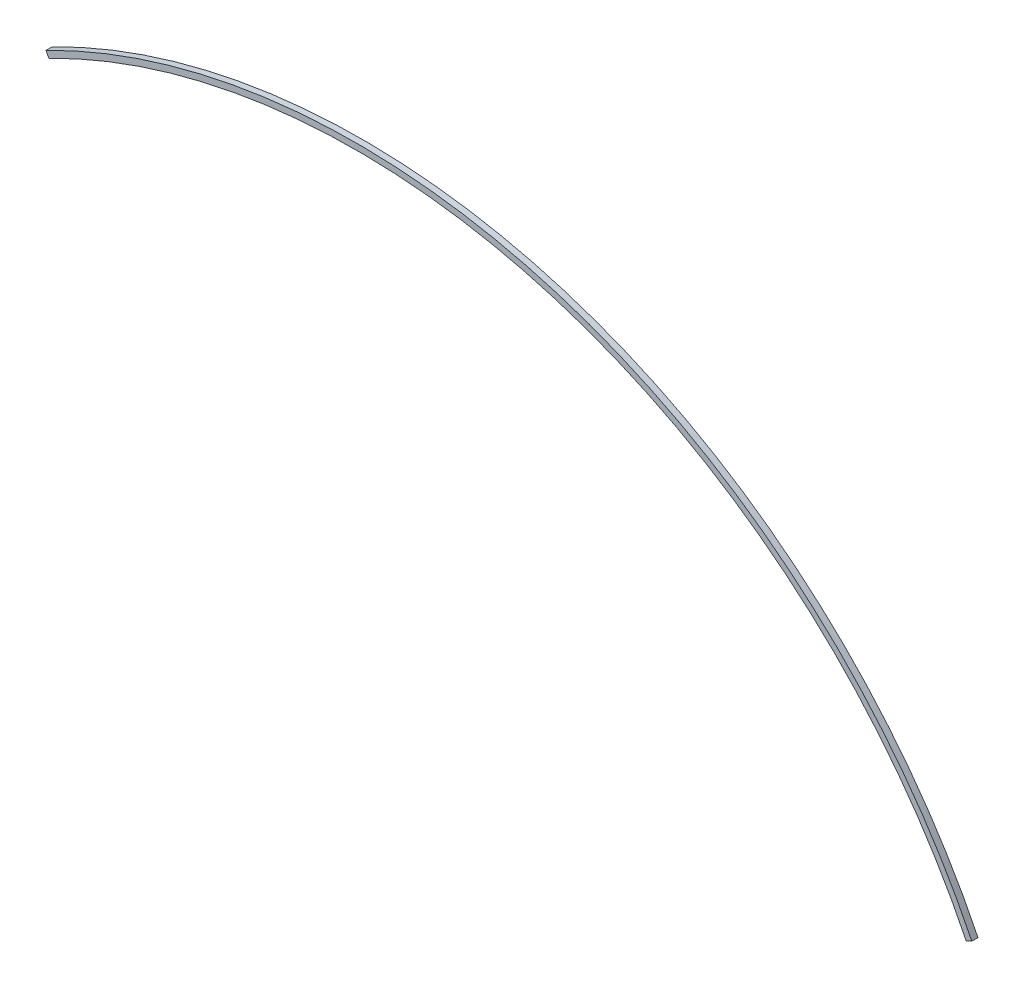
ISO-10303-21;
HEADER;
FILE_DESCRIPTION(('STEP AP214'),'2;1');
FILE_NAME('part.step','',(''),(''),'','','');
FILE_SCHEMA(('AUTOMOTIVE_DESIGN { 1 0 10303 214 1 1 1 1 }'));
ENDSEC;
DATA;
#1=APPLICATION_CONTEXT('core data for automotive mechanical design processes');
#2=APPLICATION_PROTOCOL_DEFINITION('international standard','automotive_design',2000,#1);
#3=PRODUCT_CONTEXT('',#1,'mechanical');
#4=PRODUCT('Part','Part','',(#3));
#5=PRODUCT_RELATED_PRODUCT_CATEGORY('part','',(#4));
#6=PRODUCT_DEFINITION_FORMATION('','',#4);
#7=PRODUCT_DEFINITION_CONTEXT('part definition',#1,'design');
#8=PRODUCT_DEFINITION('design','',#6,#7);
#9=PRODUCT_DEFINITION_SHAPE('','',#8);
#10=(LENGTH_UNIT() NAMED_UNIT(*) SI_UNIT(.MILLI.,.METRE.));
#11=(NAMED_UNIT(*) PLANE_ANGLE_UNIT() SI_UNIT($,.RADIAN.));
#12=(NAMED_UNIT(*) SI_UNIT($,.STERADIAN.) SOLID_ANGLE_UNIT());
#13=UNCERTAINTY_MEASURE_WITH_UNIT(LENGTH_MEASURE(1.E-05),#10,'distance_accuracy_value','');
#14=(GEOMETRIC_REPRESENTATION_CONTEXT(3) GLOBAL_UNCERTAINTY_ASSIGNED_CONTEXT((#13)) GLOBAL_UNIT_ASSIGNED_CONTEXT((#10,
#11,#12)) REPRESENTATION_CONTEXT('',''));
#15=CARTESIAN_POINT('',(0.,0.,0.));
#16=DIRECTION('',(0.,0.,1.));
#17=DIRECTION('',(1.,0.,0.));
#18=AXIS2_PLACEMENT_3D('',#15,#16,#17);
#19=CARTESIAN_POINT('',(4.36837771340562,13.1051331402177,5.));
#20=DIRECTION('',(0.,0.,-1.));
#21=DIRECTION('',(-1.,0.,0.));
#22=AXIS2_PLACEMENT_3D('',#19,#20,#21);
#23=CYLINDRICAL_SURFACE('',#22,1098.30904474855);
#24=CARTESIAN_POINT('',(4.36837771340562,13.1051331402177,-5.));
#25=DIRECTION('',(0.,0.,1.));
#26=DIRECTION('',(1.,0.,0.));
#27=AXIS2_PLACEMENT_3D('',#24,#25,#26);
#28=CIRCLE('',#27,1098.30904474855);
#29=CARTESIAN_POINT('',(-495.44920814187,991.095490273801,-5.));
#30=VERTEX_POINT('',#29);
#31=CARTESIAN_POINT('',(991.016660677776,495.606867333919,-5.));
#32=VERTEX_POINT('',#31);
#33=EDGE_CURVE('E100',#30,#32,#28,.F.);
#34=ORIENTED_EDGE('',*,*,#33,.T.);
#35=DIRECTION('',(0.,0.,-1.));
#36=VECTOR('',#35,1.);
#37=CARTESIAN_POINT('',(991.016660677776,495.606867333919,5.));
#38=LINE('',#37,#36);
#39=CARTESIAN_POINT('',(991.016660677776,495.606867333919,5.));
#40=VERTEX_POINT('',#39);
#41=EDGE_CURVE('E11',#40,#32,#38,.T.);
#42=ORIENTED_EDGE('',*,*,#41,.F.);
#43=CARTESIAN_POINT('',(4.36837771340562,13.1051331402177,5.));
#44=DIRECTION('',(0.,0.,1.));
#45=DIRECTION('',(1.,0.,0.));
#46=AXIS2_PLACEMENT_3D('',#43,#44,#45);
#47=CIRCLE('',#46,1098.30904474855);
#48=CARTESIAN_POINT('',(-495.44920814187,991.095490273801,5.));
#49=VERTEX_POINT('',#48);
#50=EDGE_CURVE('E77',#49,#40,#47,.F.);
#51=ORIENTED_EDGE('',*,*,#50,.F.);
#52=DIRECTION('',(0.,0.,-1.));
#53=VECTOR('',#52,1.);
#54=CARTESIAN_POINT('',(-495.44920814187,991.095490273801,5.));
#55=LINE('',#54,#53);
#56=EDGE_CURVE('E53',#49,#30,#55,.T.);
#57=ORIENTED_EDGE('',*,*,#56,.T.);
#58=EDGE_LOOP('',(#34,#42,#51,#57));
#59=FACE_BOUND('',#58,.T.);
#60=ADVANCED_FACE('F37',(#59),#23,.F.);
#61=CARTESIAN_POINT('',(1000.,500.,5.));
#62=DIRECTION('',(0.439313266608097,-0.89833393222238,0.));
#63=DIRECTION('',(0.89833393222238,0.439313266608097,0.));
#64=AXIS2_PLACEMENT_3D('',#61,#62,#63);
#65=PLANE('',#64);
#66=DIRECTION('',(-0.89833393222238,-0.439313266608097,0.));
#67=VECTOR('',#66,1.);
#68=CARTESIAN_POINT('',(1000.,500.,-5.));
#69=LINE('',#68,#67);
#70=CARTESIAN_POINT('',(1000.,500.,-5.));
#71=VERTEX_POINT('',#70);
#72=EDGE_CURVE('E86',#71,#32,#69,.T.);
#73=ORIENTED_EDGE('',*,*,#72,.F.);
#74=DIRECTION('',(0.,0.,-1.));
#75=VECTOR('',#74,1.);
#76=CARTESIAN_POINT('',(1000.,500.,5.));
#77=LINE('',#76,#75);
#78=CARTESIAN_POINT('',(1000.,500.,5.));
#79=VERTEX_POINT('',#78);
#80=EDGE_CURVE('E45',#79,#71,#77,.T.);
#81=ORIENTED_EDGE('',*,*,#80,.F.);
#82=DIRECTION('',(-0.89833393222238,-0.439313266608097,0.));
#83=VECTOR('',#82,1.);
#84=CARTESIAN_POINT('',(1000.,500.,5.));
#85=LINE('',#84,#83);
#86=EDGE_CURVE('E84',#79,#40,#85,.T.);
#87=ORIENTED_EDGE('',*,*,#86,.T.);
#88=ORIENTED_EDGE('',*,*,#41,.T.);
#89=EDGE_LOOP('',(#73,#81,#87,#88));
#90=FACE_BOUND('',#89,.T.);
#91=ADVANCED_FACE('F83',(#90),#65,.T.);
#92=CARTESIAN_POINT('',(4.36837771340562,13.1051331402177,5.));
#93=DIRECTION('',(0.,0.,-1.));
#94=DIRECTION('',(-1.,0.,0.));
#95=AXIS2_PLACEMENT_3D('',#92,#93,#94);
#96=CYLINDRICAL_SURFACE('',#95,1108.30904474855);
#97=CARTESIAN_POINT('',(4.36837771340562,13.1051331402177,-5.));
#98=DIRECTION('',(0.,0.,-1.));
#99=DIRECTION('',(-1.,0.,0.));
#100=AXIS2_PLACEMENT_3D('',#97,#98,#99);
#101=CIRCLE('',#100,1108.30904474855);
#102=CARTESIAN_POINT('',(-500.,1000.,-5.));
#103=VERTEX_POINT('',#102);
#104=EDGE_CURVE('E103',#103,#71,#101,.T.);
#105=ORIENTED_EDGE('',*,*,#104,.F.);
#106=DIRECTION('',(0.,0.,-1.));
#107=VECTOR('',#106,1.);
#108=CARTESIAN_POINT('',(-500.,1000.,5.));
#109=LINE('',#108,#107);
#110=CARTESIAN_POINT('',(-500.,1000.,5.));
#111=VERTEX_POINT('',#110);
#112=EDGE_CURVE('E66',#111,#103,#109,.T.);
#113=ORIENTED_EDGE('',*,*,#112,.F.);
#114=CARTESIAN_POINT('',(4.36837771340562,13.1051331402177,5.));
#115=DIRECTION('',(0.,0.,-1.));
#116=DIRECTION('',(-1.,0.,0.));
#117=AXIS2_PLACEMENT_3D('',#114,#115,#116);
#118=CIRCLE('',#117,1108.30904474855);
#119=EDGE_CURVE('E92',#111,#79,#118,.T.);
#120=ORIENTED_EDGE('',*,*,#119,.T.);
#121=ORIENTED_EDGE('',*,*,#80,.T.);
#122=EDGE_LOOP('',(#105,#113,#120,#121));
#123=FACE_BOUND('',#122,.T.);
#124=ADVANCED_FACE('F94',(#123),#96,.T.);
#125=CARTESIAN_POINT('',(-495.44920814187,991.095490273801,5.));
#126=DIRECTION('',(-0.890450972619905,-0.455079185813046,0.));
#127=DIRECTION('',(0.455079185813046,-0.890450972619905,0.));
#128=AXIS2_PLACEMENT_3D('',#125,#126,#127);
#129=PLANE('',#128);
#130=DIRECTION('',(-0.455079185813046,0.890450972619906,0.));
#131=VECTOR('',#130,1.);
#132=CARTESIAN_POINT('',(-495.44920814187,991.095490273801,-5.));
#133=LINE('',#132,#131);
#134=EDGE_CURVE('E105',#30,#103,#133,.T.);
#135=ORIENTED_EDGE('',*,*,#134,.F.);
#136=ORIENTED_EDGE('',*,*,#56,.F.);
#137=DIRECTION('',(-0.455079185813046,0.890450972619906,0.));
#138=VECTOR('',#137,1.);
#139=CARTESIAN_POINT('',(-495.44920814187,991.095490273801,5.));
#140=LINE('',#139,#138);
#141=EDGE_CURVE('E95',#49,#111,#140,.T.);
#142=ORIENTED_EDGE('',*,*,#141,.T.);
#143=ORIENTED_EDGE('',*,*,#112,.T.);
#144=EDGE_LOOP('',(#135,#136,#142,#143));
#145=FACE_BOUND('',#144,.T.);
#146=ADVANCED_FACE('F111',(#145),#129,.T.);
#147=CARTESIAN_POINT('',(4.36837771340562,13.1051331402177,5.));
#148=DIRECTION('',(0.,0.,1.));
#149=DIRECTION('',(1.,0.,0.));
#150=AXIS2_PLACEMENT_3D('',#147,#148,#149);
#151=PLANE('',#150);
#152=ORIENTED_EDGE('',*,*,#50,.T.);
#153=ORIENTED_EDGE('',*,*,#86,.F.);
#154=ORIENTED_EDGE('',*,*,#119,.F.);
#155=ORIENTED_EDGE('',*,*,#141,.F.);
#156=EDGE_LOOP('',(#152,#153,#154,#155));
#157=FACE_BOUND('',#156,.T.);
#158=ADVANCED_FACE('F91',(#157),#151,.T.);
#159=CARTESIAN_POINT('',(4.36837771340562,13.1051331402177,-5.));
#160=DIRECTION('',(0.,0.,1.));
#161=DIRECTION('',(1.,0.,0.));
#162=AXIS2_PLACEMENT_3D('',#159,#160,#161);
#163=PLANE('',#162);
#164=ORIENTED_EDGE('',*,*,#33,.F.);
#165=ORIENTED_EDGE('',*,*,#134,.T.);
#166=ORIENTED_EDGE('',*,*,#104,.T.);
#167=ORIENTED_EDGE('',*,*,#72,.T.);
#168=EDGE_LOOP('',(#164,#165,#166,#167));
#169=FACE_BOUND('',#168,.T.);
#170=ADVANCED_FACE('F110',(#169),#163,.F.);
#171=CLOSED_SHELL('',(#60,#91,#124,#146,#158,#170));
#172=MANIFOLD_SOLID_BREP('B2',#171);
#173=ADVANCED_BREP_SHAPE_REPRESENTATION('',(#18,#172),#14);
#174=SHAPE_DEFINITION_REPRESENTATION(#9,#173);
ENDSEC;
END-ISO-10303-21;
